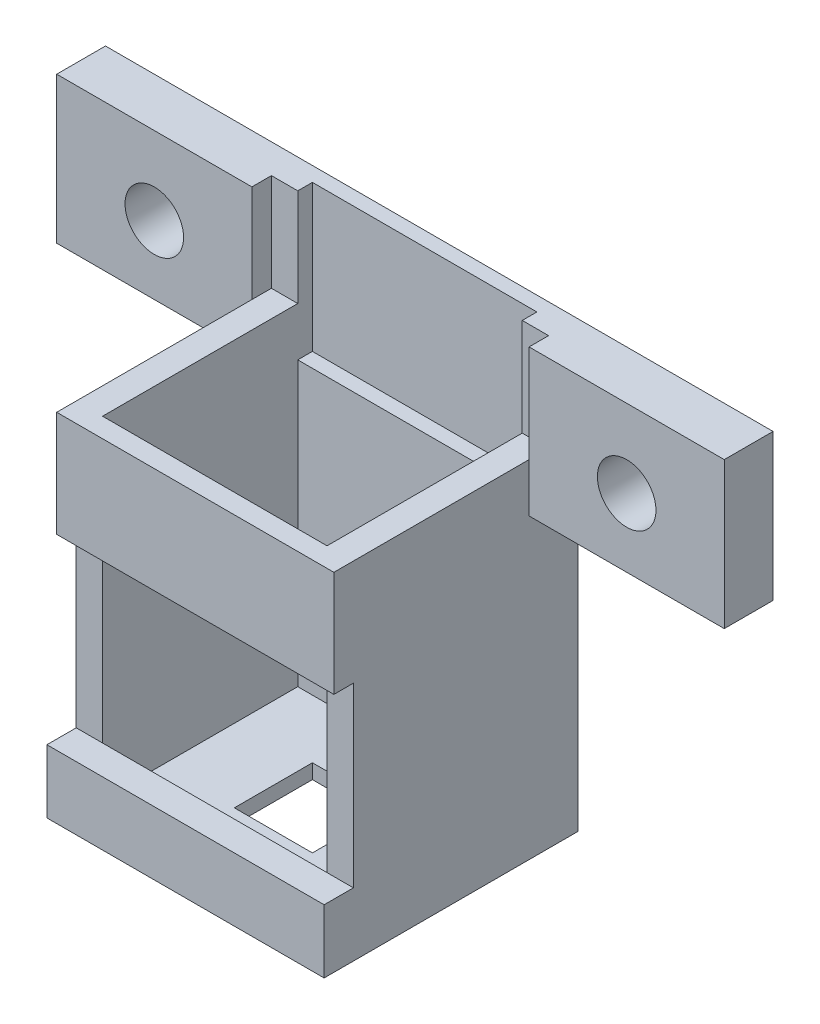
ISO-10303-21;
HEADER;
FILE_DESCRIPTION(('STEP AP214'),'2;1');
FILE_NAME('part.step','',(''),(''),'','','');
FILE_SCHEMA(('AUTOMOTIVE_DESIGN { 1 0 10303 214 1 1 1 1 }'));
ENDSEC;
DATA;
#1=APPLICATION_CONTEXT('core data for automotive mechanical design processes');
#2=APPLICATION_PROTOCOL_DEFINITION('international standard','automotive_design',2000,#1);
#3=PRODUCT_CONTEXT('',#1,'mechanical');
#4=PRODUCT('Part','Part','',(#3));
#5=PRODUCT_RELATED_PRODUCT_CATEGORY('part','',(#4));
#6=PRODUCT_DEFINITION_FORMATION('','',#4);
#7=PRODUCT_DEFINITION_CONTEXT('part definition',#1,'design');
#8=PRODUCT_DEFINITION('design','',#6,#7);
#9=PRODUCT_DEFINITION_SHAPE('','',#8);
#10=(LENGTH_UNIT() NAMED_UNIT(*) SI_UNIT(.MILLI.,.METRE.));
#11=(NAMED_UNIT(*) PLANE_ANGLE_UNIT() SI_UNIT($,.RADIAN.));
#12=(NAMED_UNIT(*) SI_UNIT($,.STERADIAN.) SOLID_ANGLE_UNIT());
#13=UNCERTAINTY_MEASURE_WITH_UNIT(LENGTH_MEASURE(1.E-05),#10,'distance_accuracy_value','');
#14=(GEOMETRIC_REPRESENTATION_CONTEXT(3) GLOBAL_UNCERTAINTY_ASSIGNED_CONTEXT((#13)) GLOBAL_UNIT_ASSIGNED_CONTEXT((#10,
#11,#12)) REPRESENTATION_CONTEXT('',''));
#15=CARTESIAN_POINT('',(0.,0.,0.));
#16=DIRECTION('',(0.,0.,1.));
#17=DIRECTION('',(1.,0.,0.));
#18=AXIS2_PLACEMENT_3D('',#15,#16,#17);
#19=CARTESIAN_POINT('',(0.,3.,0.));
#20=DIRECTION('',(0.,0.,-1.));
#21=DIRECTION('',(-1.,0.,0.));
#22=AXIS2_PLACEMENT_3D('',#19,#20,#21);
#23=PLANE('',#22);
#24=DIRECTION('',(1.,0.,0.));
#25=VECTOR('',#24,1.);
#26=CARTESIAN_POINT('',(25.7,26.1636598060892,0.));
#27=LINE('',#26,#25);
#28=CARTESIAN_POINT('',(23.,26.1636598060892,0.));
#29=VERTEX_POINT('',#28);
#30=CARTESIAN_POINT('',(25.7,26.1636598060892,0.));
#31=VERTEX_POINT('',#30);
#32=EDGE_CURVE('E276',#29,#31,#27,.T.);
#33=ORIENTED_EDGE('',*,*,#32,.F.);
#34=DIRECTION('',(0.,-1.,0.));
#35=VECTOR('',#34,1.);
#36=CARTESIAN_POINT('',(23.,0.,0.));
#37=LINE('',#36,#35);
#38=CARTESIAN_POINT('',(23.,8.,0.));
#39=VERTEX_POINT('',#38);
#40=EDGE_CURVE('E533',#29,#39,#37,.T.);
#41=ORIENTED_EDGE('',*,*,#40,.T.);
#42=DIRECTION('',(-1.,0.,0.));
#43=VECTOR('',#42,1.);
#44=CARTESIAN_POINT('',(-2.7,8.,0.));
#45=LINE('',#44,#43);
#46=CARTESIAN_POINT('',(25.7,8.,0.));
#47=VERTEX_POINT('',#46);
#48=EDGE_CURVE('E504',#47,#39,#45,.T.);
#49=ORIENTED_EDGE('',*,*,#48,.F.);
#50=DIRECTION('',(0.,-1.,0.));
#51=VECTOR('',#50,1.);
#52=CARTESIAN_POINT('',(25.7,0.,0.));
#53=LINE('',#52,#51);
#54=EDGE_CURVE('E54',#31,#47,#53,.T.);
#55=ORIENTED_EDGE('',*,*,#54,.F.);
#56=EDGE_LOOP('',(#33,#41,#49,#55));
#57=FACE_BOUND('',#56,.T.);
#58=ADVANCED_FACE('F39',(#57),#23,.F.);
#59=CARTESIAN_POINT('',(-2.7,26.1636598060892,0.));
#60=VERTEX_POINT('',#59);
#61=CARTESIAN_POINT('',(0.,26.1636598060892,0.));
#62=VERTEX_POINT('',#61);
#63=EDGE_CURVE('E62',#60,#62,#27,.T.);
#64=ORIENTED_EDGE('',*,*,#63,.F.);
#65=DIRECTION('',(0.,1.,0.));
#66=VECTOR('',#65,1.);
#67=CARTESIAN_POINT('',(-2.7,0.,0.));
#68=LINE('',#67,#66);
#69=CARTESIAN_POINT('',(-2.7,8.,0.));
#70=VERTEX_POINT('',#69);
#71=EDGE_CURVE('E544',#70,#60,#68,.T.);
#72=ORIENTED_EDGE('',*,*,#71,.F.);
#73=CARTESIAN_POINT('',(0.,8.,0.));
#74=VERTEX_POINT('',#73);
#75=EDGE_CURVE('E514',#74,#70,#45,.T.);
#76=ORIENTED_EDGE('',*,*,#75,.F.);
#77=DIRECTION('',(0.,1.,0.));
#78=VECTOR('',#77,1.);
#79=CARTESIAN_POINT('',(0.,0.,0.));
#80=LINE('',#79,#78);
#81=EDGE_CURVE('E543',#74,#62,#80,.T.);
#82=ORIENTED_EDGE('',*,*,#81,.T.);
#83=EDGE_LOOP('',(#64,#72,#76,#82));
#84=FACE_BOUND('',#83,.T.);
#85=ADVANCED_FACE('F636',(#84),#23,.F.);
#86=CARTESIAN_POINT('',(0.,0.,-20.));
#87=DIRECTION('',(0.,0.,-1.));
#88=DIRECTION('',(-1.,0.,0.));
#89=AXIS2_PLACEMENT_3D('',#86,#87,#88);
#90=PLANE('',#89);
#91=DIRECTION('',(1.,0.,0.));
#92=VECTOR('',#91,1.);
#93=CARTESIAN_POINT('',(-2.7,37.,-20.));
#94=LINE('',#93,#92);
#95=CARTESIAN_POINT('',(-2.7,37.,-20.));
#96=VERTEX_POINT('',#95);
#97=CARTESIAN_POINT('',(0.,37.,-20.));
#98=VERTEX_POINT('',#97);
#99=EDGE_CURVE('E551',#96,#98,#94,.T.);
#100=ORIENTED_EDGE('',*,*,#99,.T.);
#101=DIRECTION('',(0.,1.,0.));
#102=VECTOR('',#101,1.);
#103=CARTESIAN_POINT('',(0.,32.,-20.));
#104=LINE('',#103,#102);
#105=CARTESIAN_POINT('',(0.,47.,-20.));
#106=VERTEX_POINT('',#105);
#107=EDGE_CURVE('E313',#98,#106,#104,.T.);
#108=ORIENTED_EDGE('',*,*,#107,.T.);
#109=DIRECTION('',(1.,0.,0.));
#110=VECTOR('',#109,1.);
#111=CARTESIAN_POINT('',(25.7,47.,-20.));
#112=LINE('',#111,#110);
#113=CARTESIAN_POINT('',(-2.69999999999999,47.,-20.));
#114=VERTEX_POINT('',#113);
#115=EDGE_CURVE('E481',#114,#106,#112,.T.);
#116=ORIENTED_EDGE('',*,*,#115,.F.);
#117=DIRECTION('',(0.,1.,0.));
#118=VECTOR('',#117,1.);
#119=CARTESIAN_POINT('',(-2.69999999999999,47.,-20.));
#120=LINE('',#119,#118);
#121=EDGE_CURVE('E491',#96,#114,#120,.T.);
#122=ORIENTED_EDGE('',*,*,#121,.F.);
#123=EDGE_LOOP('',(#100,#108,#116,#122));
#124=FACE_BOUND('',#123,.T.);
#125=ADVANCED_FACE('F619',(#124),#90,.F.);
#126=CARTESIAN_POINT('',(23.,47.,-20.));
#127=VERTEX_POINT('',#126);
#128=CARTESIAN_POINT('',(25.7,47.,-20.));
#129=VERTEX_POINT('',#128);
#130=EDGE_CURVE('E495',#127,#129,#112,.T.);
#131=ORIENTED_EDGE('',*,*,#130,.F.);
#132=DIRECTION('',(0.,1.,0.));
#133=VECTOR('',#132,1.);
#134=CARTESIAN_POINT('',(23.,32.,-20.));
#135=LINE('',#134,#133);
#136=CARTESIAN_POINT('',(23.,37.,-20.));
#137=VERTEX_POINT('',#136);
#138=EDGE_CURVE('E330',#137,#127,#135,.T.);
#139=ORIENTED_EDGE('',*,*,#138,.F.);
#140=DIRECTION('',(-1.,0.,0.));
#141=VECTOR('',#140,1.);
#142=CARTESIAN_POINT('',(25.7,37.,-20.));
#143=LINE('',#142,#141);
#144=CARTESIAN_POINT('',(25.7,37.,-20.));
#145=VERTEX_POINT('',#144);
#146=EDGE_CURVE('E527',#145,#137,#143,.T.);
#147=ORIENTED_EDGE('',*,*,#146,.F.);
#148=DIRECTION('',(0.,-1.,0.));
#149=VECTOR('',#148,1.);
#150=CARTESIAN_POINT('',(25.7,47.,-20.));
#151=LINE('',#150,#149);
#152=EDGE_CURVE('E475',#129,#145,#151,.T.);
#153=ORIENTED_EDGE('',*,*,#152,.F.);
#154=EDGE_LOOP('',(#131,#139,#147,#153));
#155=FACE_BOUND('',#154,.T.);
#156=ADVANCED_FACE('F644',(#155),#90,.F.);
#157=CARTESIAN_POINT('',(25.7,0.,0.));
#158=DIRECTION('',(-1.,0.,0.));
#159=DIRECTION('',(0.,0.,1.));
#160=AXIS2_PLACEMENT_3D('',#157,#158,#159);
#161=PLANE('',#160);
#162=DIRECTION('',(0.,0.,1.));
#163=VECTOR('',#162,1.);
#164=CARTESIAN_POINT('',(25.7,1.5,0.));
#165=LINE('',#164,#163);
#166=CARTESIAN_POINT('',(25.7,1.5,-23.));
#167=VERTEX_POINT('',#166);
#168=CARTESIAN_POINT('',(25.7,1.5,3.));
#169=VERTEX_POINT('',#168);
#170=EDGE_CURVE('E353',#167,#169,#165,.T.);
#171=ORIENTED_EDGE('',*,*,#170,.F.);
#172=DIRECTION('',(0.,-1.,0.));
#173=VECTOR('',#172,1.);
#174=CARTESIAN_POINT('',(25.7,47.,-23.));
#175=LINE('',#174,#173);
#176=CARTESIAN_POINT('',(25.7,32.,-23.));
#177=VERTEX_POINT('',#176);
#178=EDGE_CURVE('E476',#177,#167,#175,.T.);
#179=ORIENTED_EDGE('',*,*,#178,.F.);
#180=DIRECTION('',(0.,0.,-1.));
#181=VECTOR('',#180,1.);
#182=CARTESIAN_POINT('',(25.7,32.,-23.));
#183=LINE('',#182,#181);
#184=CARTESIAN_POINT('',(25.7,32.,-18.));
#185=VERTEX_POINT('',#184);
#186=EDGE_CURVE('E445',#185,#177,#183,.T.);
#187=ORIENTED_EDGE('',*,*,#186,.F.);
#188=DIRECTION('',(0.,-1.,0.));
#189=VECTOR('',#188,1.);
#190=CARTESIAN_POINT('',(25.7,47.,-18.));
#191=LINE('',#190,#189);
#192=CARTESIAN_POINT('',(25.7,37.,-18.));
#193=VERTEX_POINT('',#192);
#194=EDGE_CURVE('E47',#193,#185,#191,.T.);
#195=ORIENTED_EDGE('',*,*,#194,.F.);
#196=DIRECTION('',(0.,0.,1.));
#197=VECTOR('',#196,1.);
#198=CARTESIAN_POINT('',(25.7,37.,0.));
#199=LINE('',#198,#197);
#200=CARTESIAN_POINT('',(25.7,37.,2.));
#201=VERTEX_POINT('',#200);
#202=EDGE_CURVE('E242',#193,#201,#199,.T.);
#203=ORIENTED_EDGE('',*,*,#202,.T.);
#204=DIRECTION('',(0.,1.,0.));
#205=VECTOR('',#204,1.);
#206=CARTESIAN_POINT('',(25.7,37.,2.));
#207=LINE('',#206,#205);
#208=CARTESIAN_POINT('',(25.7,26.1636598060892,2.));
#209=VERTEX_POINT('',#208);
#210=EDGE_CURVE('E248',#209,#201,#207,.T.);
#211=ORIENTED_EDGE('',*,*,#210,.F.);
#212=DIRECTION('',(0.,0.,-1.));
#213=VECTOR('',#212,1.);
#214=CARTESIAN_POINT('',(25.7,26.1636598060892,2.));
#215=LINE('',#214,#213);
#216=EDGE_CURVE('E282',#209,#31,#215,.T.);
#217=ORIENTED_EDGE('',*,*,#216,.T.);
#218=ORIENTED_EDGE('',*,*,#54,.T.);
#219=DIRECTION('',(0.,0.,-1.));
#220=VECTOR('',#219,1.);
#221=CARTESIAN_POINT('',(25.7,8.,3.));
#222=LINE('',#221,#220);
#223=CARTESIAN_POINT('',(25.7,8.,3.));
#224=VERTEX_POINT('',#223);
#225=EDGE_CURVE('E518',#224,#47,#222,.T.);
#226=ORIENTED_EDGE('',*,*,#225,.F.);
#227=DIRECTION('',(0.,1.,0.));
#228=VECTOR('',#227,1.);
#229=CARTESIAN_POINT('',(25.7,0.,3.));
#230=LINE('',#229,#228);
#231=EDGE_CURVE('E503',#169,#224,#230,.T.);
#232=ORIENTED_EDGE('',*,*,#231,.F.);
#233=EDGE_LOOP('',(#171,#179,#187,#195,#203,#211,#217,#218,#226,#232));
#234=FACE_BOUND('',#233,.T.);
#235=ADVANCED_FACE('F245',(#234),#161,.F.);
#236=CARTESIAN_POINT('',(-2.7,0.,0.));
#237=DIRECTION('',(-1.,0.,0.));
#238=DIRECTION('',(0.,0.,1.));
#239=AXIS2_PLACEMENT_3D('',#236,#237,#238);
#240=PLANE('',#239);
#241=DIRECTION('',(0.,1.,0.));
#242=VECTOR('',#241,1.);
#243=CARTESIAN_POINT('',(-2.69999999999999,47.,-23.));
#244=LINE('',#243,#242);
#245=CARTESIAN_POINT('',(-2.7,1.5,-23.));
#246=VERTEX_POINT('',#245);
#247=CARTESIAN_POINT('',(-2.7,32.,-23.));
#248=VERTEX_POINT('',#247);
#249=EDGE_CURVE('E480',#246,#248,#244,.T.);
#250=ORIENTED_EDGE('',*,*,#249,.F.);
#251=DIRECTION('',(0.,0.,-1.));
#252=VECTOR('',#251,1.);
#253=CARTESIAN_POINT('',(-2.7,1.5,3.));
#254=LINE('',#253,#252);
#255=CARTESIAN_POINT('',(-2.7,1.5,3.));
#256=VERTEX_POINT('',#255);
#257=EDGE_CURVE('E326',#256,#246,#254,.T.);
#258=ORIENTED_EDGE('',*,*,#257,.F.);
#259=DIRECTION('',(0.,-1.,0.));
#260=VECTOR('',#259,1.);
#261=CARTESIAN_POINT('',(-2.7,0.,3.));
#262=LINE('',#261,#260);
#263=CARTESIAN_POINT('',(-2.7,8.,3.));
#264=VERTEX_POINT('',#263);
#265=EDGE_CURVE('E499',#264,#256,#262,.T.);
#266=ORIENTED_EDGE('',*,*,#265,.F.);
#267=DIRECTION('',(0.,0.,-1.));
#268=VECTOR('',#267,1.);
#269=CARTESIAN_POINT('',(-2.7,8.,3.));
#270=LINE('',#269,#268);
#271=EDGE_CURVE('E510',#264,#70,#270,.T.);
#272=ORIENTED_EDGE('',*,*,#271,.T.);
#273=ORIENTED_EDGE('',*,*,#71,.T.);
#274=DIRECTION('',(0.,0.,-1.));
#275=VECTOR('',#274,1.);
#276=CARTESIAN_POINT('',(-2.7,26.1636598060892,2.));
#277=LINE('',#276,#275);
#278=CARTESIAN_POINT('',(-2.7,26.1636598060892,2.));
#279=VERTEX_POINT('',#278);
#280=EDGE_CURVE('E289',#279,#60,#277,.T.);
#281=ORIENTED_EDGE('',*,*,#280,.F.);
#282=DIRECTION('',(0.,-1.,0.));
#283=VECTOR('',#282,1.);
#284=CARTESIAN_POINT('',(-2.7,37.,2.));
#285=LINE('',#284,#283);
#286=CARTESIAN_POINT('',(-2.7,37.,2.));
#287=VERTEX_POINT('',#286);
#288=EDGE_CURVE('E265',#287,#279,#285,.T.);
#289=ORIENTED_EDGE('',*,*,#288,.F.);
#290=DIRECTION('',(0.,0.,-1.));
#291=VECTOR('',#290,1.);
#292=CARTESIAN_POINT('',(-2.7,37.,0.));
#293=LINE('',#292,#291);
#294=CARTESIAN_POINT('',(-2.7,37.,-18.));
#295=VERTEX_POINT('',#294);
#296=EDGE_CURVE('E261',#287,#295,#293,.T.);
#297=ORIENTED_EDGE('',*,*,#296,.T.);
#298=DIRECTION('',(0.,1.,0.));
#299=VECTOR('',#298,1.);
#300=CARTESIAN_POINT('',(-2.7,47.,-18.));
#301=LINE('',#300,#299);
#302=CARTESIAN_POINT('',(-2.7,32.,-18.));
#303=VERTEX_POINT('',#302);
#304=EDGE_CURVE('E421',#303,#295,#301,.T.);
#305=ORIENTED_EDGE('',*,*,#304,.F.);
#306=DIRECTION('',(0.,0.,1.));
#307=VECTOR('',#306,1.);
#308=CARTESIAN_POINT('',(-2.7,32.,-23.));
#309=LINE('',#308,#307);
#310=EDGE_CURVE('E392',#248,#303,#309,.T.);
#311=ORIENTED_EDGE('',*,*,#310,.F.);
#312=EDGE_LOOP('',(#250,#258,#266,#272,#273,#281,#289,#297,#305,#311));
#313=FACE_BOUND('',#312,.T.);
#314=ADVANCED_FACE('F634',(#313),#240,.T.);
#315=CARTESIAN_POINT('',(0.,0.,3.));
#316=DIRECTION('',(0.,0.,-1.));
#317=DIRECTION('',(-1.,0.,0.));
#318=AXIS2_PLACEMENT_3D('',#315,#316,#317);
#319=PLANE('',#318);
#320=DIRECTION('',(-1.,0.,0.));
#321=VECTOR('',#320,1.);
#322=CARTESIAN_POINT('',(-2.7,1.5,3.));
#323=LINE('',#322,#321);
#324=EDGE_CURVE('E341',#169,#256,#323,.T.);
#325=ORIENTED_EDGE('',*,*,#324,.F.);
#326=ORIENTED_EDGE('',*,*,#231,.T.);
#327=DIRECTION('',(-1.,0.,0.));
#328=VECTOR('',#327,1.);
#329=CARTESIAN_POINT('',(-2.7,8.,3.));
#330=LINE('',#329,#328);
#331=EDGE_CURVE('E507',#224,#264,#330,.T.);
#332=ORIENTED_EDGE('',*,*,#331,.T.);
#333=ORIENTED_EDGE('',*,*,#265,.T.);
#334=EDGE_LOOP('',(#325,#326,#332,#333));
#335=FACE_BOUND('',#334,.T.);
#336=ADVANCED_FACE('F674',(#335),#319,.F.);
#337=CARTESIAN_POINT('',(0.,0.,-23.));
#338=DIRECTION('',(0.,0.,-1.));
#339=DIRECTION('',(-1.,0.,0.));
#340=AXIS2_PLACEMENT_3D('',#337,#338,#339);
#341=PLANE('',#340);
#342=CARTESIAN_POINT('',(-12.7,39.,-23.));
#343=DIRECTION('',(0.,0.,-1.));
#344=DIRECTION('',(-1.,0.,0.));
#345=AXIS2_PLACEMENT_3D('',#342,#343,#344);
#346=CIRCLE('',#345,3.);
#347=CARTESIAN_POINT('',(-15.7,39.,-23.));
#348=VERTEX_POINT('',#347);
#349=EDGE_CURVE('E361',#348,#348,#346,.T.);
#350=ORIENTED_EDGE('',*,*,#349,.F.);
#351=EDGE_LOOP('',(#350));
#352=FACE_BOUND('',#351,.T.);
#353=CARTESIAN_POINT('',(35.7,39.,-23.));
#354=DIRECTION('',(0.,0.,-1.));
#355=DIRECTION('',(-1.,0.,0.));
#356=AXIS2_PLACEMENT_3D('',#353,#354,#355);
#357=CIRCLE('',#356,3.);
#358=CARTESIAN_POINT('',(32.7,39.,-23.));
#359=VERTEX_POINT('',#358);
#360=EDGE_CURVE('E368',#359,#359,#357,.T.);
#361=ORIENTED_EDGE('',*,*,#360,.F.);
#362=EDGE_LOOP('',(#361));
#363=FACE_BOUND('',#362,.T.);
#364=ORIENTED_EDGE('',*,*,#178,.T.);
#365=DIRECTION('',(1.,0.,0.));
#366=VECTOR('',#365,1.);
#367=CARTESIAN_POINT('',(-2.7,1.5,-23.));
#368=LINE('',#367,#366);
#369=EDGE_CURVE('E338',#246,#167,#368,.T.);
#370=ORIENTED_EDGE('',*,*,#369,.F.);
#371=ORIENTED_EDGE('',*,*,#249,.T.);
#372=DIRECTION('',(1.,0.,0.));
#373=VECTOR('',#372,1.);
#374=CARTESIAN_POINT('',(-22.7,32.,-23.));
#375=LINE('',#374,#373);
#376=CARTESIAN_POINT('',(-22.7,32.,-23.));
#377=VERTEX_POINT('',#376);
#378=EDGE_CURVE('E435',#377,#248,#375,.T.);
#379=ORIENTED_EDGE('',*,*,#378,.F.);
#380=DIRECTION('',(0.,-1.,0.));
#381=VECTOR('',#380,1.);
#382=CARTESIAN_POINT('',(-22.7,47.,-23.));
#383=LINE('',#382,#381);
#384=CARTESIAN_POINT('',(-22.7,47.,-23.));
#385=VERTEX_POINT('',#384);
#386=EDGE_CURVE('E401',#385,#377,#383,.T.);
#387=ORIENTED_EDGE('',*,*,#386,.F.);
#388=DIRECTION('',(1.,0.,0.));
#389=VECTOR('',#388,1.);
#390=CARTESIAN_POINT('',(25.7,47.,-23.));
#391=LINE('',#390,#389);
#392=CARTESIAN_POINT('',(45.7,47.,-23.));
#393=VERTEX_POINT('',#392);
#394=EDGE_CURVE('E484',#385,#393,#391,.T.);
#395=ORIENTED_EDGE('',*,*,#394,.T.);
#396=DIRECTION('',(0.,1.,0.));
#397=VECTOR('',#396,1.);
#398=CARTESIAN_POINT('',(45.7,47.,-23.));
#399=LINE('',#398,#397);
#400=CARTESIAN_POINT('',(45.7,32.,-23.));
#401=VERTEX_POINT('',#400);
#402=EDGE_CURVE('E440',#401,#393,#399,.T.);
#403=ORIENTED_EDGE('',*,*,#402,.F.);
#404=DIRECTION('',(-1.,0.,0.));
#405=VECTOR('',#404,1.);
#406=CARTESIAN_POINT('',(45.7,32.,-23.));
#407=LINE('',#406,#405);
#408=EDGE_CURVE('E454',#401,#177,#407,.T.);
#409=ORIENTED_EDGE('',*,*,#408,.T.);
#410=EDGE_LOOP('',(#364,#370,#371,#379,#387,#395,#403,#409));
#411=FACE_BOUND('',#410,.T.);
#412=ADVANCED_FACE('F668',(#352,#363,#411),#341,.T.);
#413=CARTESIAN_POINT('',(7.5,-12.,-6.));
#414=DIRECTION('',(-1.,0.,0.));
#415=DIRECTION('',(0.,0.,1.));
#416=AXIS2_PLACEMENT_3D('',#413,#414,#415);
#417=PLANE('',#416);
#418=DIRECTION('',(0.,0.,1.));
#419=VECTOR('',#418,1.);
#420=CARTESIAN_POINT('',(7.5,1.5,-6.));
#421=LINE('',#420,#419);
#422=CARTESIAN_POINT('',(7.5,1.5,-14.));
#423=VERTEX_POINT('',#422);
#424=CARTESIAN_POINT('',(7.5,1.5,-6.));
#425=VERTEX_POINT('',#424);
#426=EDGE_CURVE('E350',#423,#425,#421,.T.);
#427=ORIENTED_EDGE('',*,*,#426,.F.);
#428=DIRECTION('',(0.,1.,0.));
#429=VECTOR('',#428,1.);
#430=CARTESIAN_POINT('',(7.5,-12.,-14.));
#431=LINE('',#430,#429);
#432=CARTESIAN_POINT('',(7.5,3.,-14.));
#433=VERTEX_POINT('',#432);
#434=EDGE_CURVE('E389',#423,#433,#431,.T.);
#435=ORIENTED_EDGE('',*,*,#434,.T.);
#436=DIRECTION('',(0.,0.,1.));
#437=VECTOR('',#436,1.);
#438=CARTESIAN_POINT('',(7.5,3.,-6.));
#439=LINE('',#438,#437);
#440=CARTESIAN_POINT('',(7.5,3.,-6.));
#441=VERTEX_POINT('',#440);
#442=EDGE_CURVE('E372',#433,#441,#439,.T.);
#443=ORIENTED_EDGE('',*,*,#442,.T.);
#444=DIRECTION('',(0.,1.,0.));
#445=VECTOR('',#444,1.);
#446=CARTESIAN_POINT('',(7.5,-12.,-6.));
#447=LINE('',#446,#445);
#448=EDGE_CURVE('E388',#425,#441,#447,.T.);
#449=ORIENTED_EDGE('',*,*,#448,.F.);
#450=EDGE_LOOP('',(#427,#435,#443,#449));
#451=FACE_BOUND('',#450,.T.);
#452=ADVANCED_FACE('F756',(#451),#417,.F.);
#453=CARTESIAN_POINT('',(7.5,-12.,-14.));
#454=DIRECTION('',(0.,0.,-1.));
#455=DIRECTION('',(-1.,0.,0.));
#456=AXIS2_PLACEMENT_3D('',#453,#454,#455);
#457=PLANE('',#456);
#458=DIRECTION('',(-1.,0.,0.));
#459=VECTOR('',#458,1.);
#460=CARTESIAN_POINT('',(7.5,1.5,-14.));
#461=LINE('',#460,#459);
#462=CARTESIAN_POINT('',(15.5,1.5,-14.));
#463=VERTEX_POINT('',#462);
#464=EDGE_CURVE('E347',#463,#423,#461,.T.);
#465=ORIENTED_EDGE('',*,*,#464,.F.);
#466=DIRECTION('',(0.,1.,0.));
#467=VECTOR('',#466,1.);
#468=CARTESIAN_POINT('',(15.5,-12.,-14.));
#469=LINE('',#468,#467);
#470=CARTESIAN_POINT('',(15.5,3.,-14.));
#471=VERTEX_POINT('',#470);
#472=EDGE_CURVE('E393',#463,#471,#469,.T.);
#473=ORIENTED_EDGE('',*,*,#472,.T.);
#474=DIRECTION('',(-1.,0.,0.));
#475=VECTOR('',#474,1.);
#476=CARTESIAN_POINT('',(7.5,3.,-14.));
#477=LINE('',#476,#475);
#478=EDGE_CURVE('E384',#471,#433,#477,.T.);
#479=ORIENTED_EDGE('',*,*,#478,.T.);
#480=ORIENTED_EDGE('',*,*,#434,.F.);
#481=EDGE_LOOP('',(#465,#473,#479,#480));
#482=FACE_BOUND('',#481,.T.);
#483=ADVANCED_FACE('F750',(#482),#457,.F.);
#484=CARTESIAN_POINT('',(15.5,-12.,-6.));
#485=DIRECTION('',(1.,0.,0.));
#486=DIRECTION('',(0.,0.,-1.));
#487=AXIS2_PLACEMENT_3D('',#484,#485,#486);
#488=PLANE('',#487);
#489=DIRECTION('',(0.,0.,-1.));
#490=VECTOR('',#489,1.);
#491=CARTESIAN_POINT('',(15.5,1.5,-6.));
#492=LINE('',#491,#490);
#493=CARTESIAN_POINT('',(15.5,1.5,-6.));
#494=VERTEX_POINT('',#493);
#495=EDGE_CURVE('E344',#494,#463,#492,.T.);
#496=ORIENTED_EDGE('',*,*,#495,.F.);
#497=DIRECTION('',(0.,1.,0.));
#498=VECTOR('',#497,1.);
#499=CARTESIAN_POINT('',(15.5,-12.,-6.));
#500=LINE('',#499,#498);
#501=CARTESIAN_POINT('',(15.5,3.,-6.));
#502=VERTEX_POINT('',#501);
#503=EDGE_CURVE('E396',#494,#502,#500,.T.);
#504=ORIENTED_EDGE('',*,*,#503,.T.);
#505=DIRECTION('',(0.,0.,-1.));
#506=VECTOR('',#505,1.);
#507=CARTESIAN_POINT('',(15.5,3.,-6.));
#508=LINE('',#507,#506);
#509=EDGE_CURVE('E380',#502,#471,#508,.T.);
#510=ORIENTED_EDGE('',*,*,#509,.T.);
#511=ORIENTED_EDGE('',*,*,#472,.F.);
#512=EDGE_LOOP('',(#496,#504,#510,#511));
#513=FACE_BOUND('',#512,.T.);
#514=ADVANCED_FACE('F744',(#513),#488,.F.);
#515=CARTESIAN_POINT('',(7.5,-12.,-6.));
#516=DIRECTION('',(0.,0.,1.));
#517=DIRECTION('',(1.,0.,0.));
#518=AXIS2_PLACEMENT_3D('',#515,#516,#517);
#519=PLANE('',#518);
#520=DIRECTION('',(1.,0.,0.));
#521=VECTOR('',#520,1.);
#522=CARTESIAN_POINT('',(7.5,1.5,-6.));
#523=LINE('',#522,#521);
#524=EDGE_CURVE('E11',#425,#494,#523,.T.);
#525=ORIENTED_EDGE('',*,*,#524,.F.);
#526=ORIENTED_EDGE('',*,*,#448,.T.);
#527=DIRECTION('',(1.,0.,0.));
#528=VECTOR('',#527,1.);
#529=CARTESIAN_POINT('',(7.5,3.,-6.));
#530=LINE('',#529,#528);
#531=EDGE_CURVE('E376',#441,#502,#530,.T.);
#532=ORIENTED_EDGE('',*,*,#531,.T.);
#533=ORIENTED_EDGE('',*,*,#503,.F.);
#534=EDGE_LOOP('',(#525,#526,#532,#533));
#535=FACE_BOUND('',#534,.T.);
#536=ADVANCED_FACE('F739',(#535),#519,.F.);
#537=CARTESIAN_POINT('',(0.,3.,0.));
#538=DIRECTION('',(0.,-1.,0.));
#539=DIRECTION('',(0.,0.,-1.));
#540=AXIS2_PLACEMENT_3D('',#537,#538,#539);
#541=PLANE('',#540);
#542=DIRECTION('',(0.,0.,1.));
#543=VECTOR('',#542,1.);
#544=CARTESIAN_POINT('',(0.,3.,0.));
#545=LINE('',#544,#543);
#546=CARTESIAN_POINT('',(0.,3.,-20.));
#547=VERTEX_POINT('',#546);
#548=CARTESIAN_POINT('',(0.,3.,0.));
#549=VERTEX_POINT('',#548);
#550=EDGE_CURVE('E564',#547,#549,#545,.T.);
#551=ORIENTED_EDGE('',*,*,#550,.T.);
#552=DIRECTION('',(1.,0.,0.));
#553=VECTOR('',#552,1.);
#554=CARTESIAN_POINT('',(0.,3.,0.));
#555=LINE('',#554,#553);
#556=CARTESIAN_POINT('',(23.,3.,0.));
#557=VERTEX_POINT('',#556);
#558=EDGE_CURVE('E568',#549,#557,#555,.T.);
#559=ORIENTED_EDGE('',*,*,#558,.T.);
#560=DIRECTION('',(0.,0.,-1.));
#561=VECTOR('',#560,1.);
#562=CARTESIAN_POINT('',(23.,3.,0.));
#563=LINE('',#562,#561);
#564=CARTESIAN_POINT('',(23.,3.,-20.));
#565=VERTEX_POINT('',#564);
#566=EDGE_CURVE('E572',#557,#565,#563,.T.);
#567=ORIENTED_EDGE('',*,*,#566,.T.);
#568=DIRECTION('',(-1.,0.,0.));
#569=VECTOR('',#568,1.);
#570=CARTESIAN_POINT('',(0.,3.,-20.));
#571=LINE('',#570,#569);
#572=EDGE_CURVE('E575',#565,#547,#571,.T.);
#573=ORIENTED_EDGE('',*,*,#572,.T.);
#574=EDGE_LOOP('',(#551,#559,#567,#573));
#575=FACE_BOUND('',#574,.T.);
#576=ORIENTED_EDGE('',*,*,#442,.F.);
#577=ORIENTED_EDGE('',*,*,#478,.F.);
#578=ORIENTED_EDGE('',*,*,#509,.F.);
#579=ORIENTED_EDGE('',*,*,#531,.F.);
#580=EDGE_LOOP('',(#576,#577,#578,#579));
#581=FACE_BOUND('',#580,.T.);
#582=ADVANCED_FACE('F598',(#575,#581),#541,.F.);
#583=CARTESIAN_POINT('',(-2.7,37.,0.));
#584=DIRECTION('',(0.,-1.,0.));
#585=DIRECTION('',(0.,0.,-1.));
#586=AXIS2_PLACEMENT_3D('',#583,#584,#585);
#587=PLANE('',#586);
#588=DIRECTION('',(0.,0.,-1.));
#589=VECTOR('',#588,1.);
#590=CARTESIAN_POINT('',(0.,37.,0.));
#591=LINE('',#590,#589);
#592=CARTESIAN_POINT('',(0.,37.,0.));
#593=VERTEX_POINT('',#592);
#594=EDGE_CURVE('E556',#593,#98,#591,.T.);
#595=ORIENTED_EDGE('',*,*,#594,.T.);
#596=ORIENTED_EDGE('',*,*,#99,.F.);
#597=EDGE_CURVE('E547',#295,#96,#293,.T.);
#598=ORIENTED_EDGE('',*,*,#597,.F.);
#599=ORIENTED_EDGE('',*,*,#296,.F.);
#600=DIRECTION('',(-1.,0.,0.));
#601=VECTOR('',#600,1.);
#602=CARTESIAN_POINT('',(25.7,37.,2.));
#603=LINE('',#602,#601);
#604=EDGE_CURVE('E257',#201,#287,#603,.T.);
#605=ORIENTED_EDGE('',*,*,#604,.F.);
#606=ORIENTED_EDGE('',*,*,#202,.F.);
#607=EDGE_CURVE('E254',#145,#193,#199,.T.);
#608=ORIENTED_EDGE('',*,*,#607,.F.);
#609=ORIENTED_EDGE('',*,*,#146,.T.);
#610=DIRECTION('',(0.,0.,1.));
#611=VECTOR('',#610,1.);
#612=CARTESIAN_POINT('',(23.,37.,0.));
#613=LINE('',#612,#611);
#614=CARTESIAN_POINT('',(23.,37.,0.));
#615=VERTEX_POINT('',#614);
#616=EDGE_CURVE('E524',#137,#615,#613,.T.);
#617=ORIENTED_EDGE('',*,*,#616,.T.);
#618=DIRECTION('',(-1.,0.,0.));
#619=VECTOR('',#618,1.);
#620=CARTESIAN_POINT('',(25.7,37.,0.));
#621=LINE('',#620,#619);
#622=EDGE_CURVE('E283',#615,#593,#621,.T.);
#623=ORIENTED_EDGE('',*,*,#622,.T.);
#624=EDGE_LOOP('',(#595,#596,#598,#599,#605,#606,#608,#609,#617,#623));
#625=FACE_BOUND('',#624,.T.);
#626=ADVANCED_FACE('F259',(#625),#587,.F.);
#627=CARTESIAN_POINT('',(0.,0.,0.));
#628=DIRECTION('',(-1.,0.,0.));
#629=DIRECTION('',(0.,0.,1.));
#630=AXIS2_PLACEMENT_3D('',#627,#628,#629);
#631=PLANE('',#630);
#632=ORIENTED_EDGE('',*,*,#550,.F.);
#633=DIRECTION('',(0.,-1.,0.));
#634=VECTOR('',#633,1.);
#635=CARTESIAN_POINT('',(0.,0.,-20.));
#636=LINE('',#635,#634);
#637=CARTESIAN_POINT('',(0.,32.,-20.));
#638=VERTEX_POINT('',#637);
#639=EDGE_CURVE('E548',#638,#547,#636,.T.);
#640=ORIENTED_EDGE('',*,*,#639,.F.);
#641=DIRECTION('',(0.,0.,1.));
#642=VECTOR('',#641,1.);
#643=CARTESIAN_POINT('',(0.,32.,-20.));
#644=LINE('',#643,#642);
#645=CARTESIAN_POINT('',(0.,32.,-21.5));
#646=VERTEX_POINT('',#645);
#647=EDGE_CURVE('E297',#646,#638,#644,.T.);
#648=ORIENTED_EDGE('',*,*,#647,.F.);
#649=DIRECTION('',(0.,1.,0.));
#650=VECTOR('',#649,1.);
#651=CARTESIAN_POINT('',(0.,32.,-21.5));
#652=LINE('',#651,#650);
#653=CARTESIAN_POINT('',(0.,47.,-21.5));
#654=VERTEX_POINT('',#653);
#655=EDGE_CURVE('E323',#646,#654,#652,.T.);
#656=ORIENTED_EDGE('',*,*,#655,.T.);
#657=DIRECTION('',(0.,0.,1.));
#658=VECTOR('',#657,1.);
#659=CARTESIAN_POINT('',(0.,47.,-20.));
#660=LINE('',#659,#658);
#661=EDGE_CURVE('E296',#654,#106,#660,.T.);
#662=ORIENTED_EDGE('',*,*,#661,.T.);
#663=ORIENTED_EDGE('',*,*,#107,.F.);
#664=ORIENTED_EDGE('',*,*,#594,.F.);
#665=DIRECTION('',(0.,-1.,0.));
#666=VECTOR('',#665,1.);
#667=CARTESIAN_POINT('',(0.,0.,0.));
#668=LINE('',#667,#666);
#669=EDGE_CURVE('E293',#593,#62,#668,.T.);
#670=ORIENTED_EDGE('',*,*,#669,.T.);
#671=ORIENTED_EDGE('',*,*,#81,.F.);
#672=EDGE_CURVE('E552',#549,#74,#80,.T.);
#673=ORIENTED_EDGE('',*,*,#672,.F.);
#674=EDGE_LOOP('',(#632,#640,#648,#656,#662,#663,#664,#670,#671,#673));
#675=FACE_BOUND('',#674,.T.);
#676=ADVANCED_FACE('F596',(#675),#631,.F.);
#677=CARTESIAN_POINT('',(23.,0.,0.));
#678=DIRECTION('',(-1.,0.,0.));
#679=DIRECTION('',(0.,0.,1.));
#680=AXIS2_PLACEMENT_3D('',#677,#678,#679);
#681=PLANE('',#680);
#682=ORIENTED_EDGE('',*,*,#566,.F.);
#683=EDGE_CURVE('E522',#39,#557,#37,.T.);
#684=ORIENTED_EDGE('',*,*,#683,.F.);
#685=ORIENTED_EDGE('',*,*,#40,.F.);
#686=EDGE_CURVE('E528',#615,#29,#37,.T.);
#687=ORIENTED_EDGE('',*,*,#686,.F.);
#688=ORIENTED_EDGE('',*,*,#616,.F.);
#689=ORIENTED_EDGE('',*,*,#138,.T.);
#690=DIRECTION('',(0.,0.,-1.));
#691=VECTOR('',#690,1.);
#692=CARTESIAN_POINT('',(23.,47.,-20.));
#693=LINE('',#692,#691);
#694=CARTESIAN_POINT('',(23.,47.,-21.5));
#695=VERTEX_POINT('',#694);
#696=EDGE_CURVE('E316',#127,#695,#693,.T.);
#697=ORIENTED_EDGE('',*,*,#696,.T.);
#698=DIRECTION('',(0.,1.,0.));
#699=VECTOR('',#698,1.);
#700=CARTESIAN_POINT('',(23.,32.,-21.5));
#701=LINE('',#700,#699);
#702=CARTESIAN_POINT('',(23.,32.,-21.5));
#703=VERTEX_POINT('',#702);
#704=EDGE_CURVE('E327',#703,#695,#701,.T.);
#705=ORIENTED_EDGE('',*,*,#704,.F.);
#706=DIRECTION('',(0.,0.,-1.));
#707=VECTOR('',#706,1.);
#708=CARTESIAN_POINT('',(23.,32.,-20.));
#709=LINE('',#708,#707);
#710=CARTESIAN_POINT('',(23.,32.,-20.));
#711=VERTEX_POINT('',#710);
#712=EDGE_CURVE('E305',#711,#703,#709,.T.);
#713=ORIENTED_EDGE('',*,*,#712,.F.);
#714=DIRECTION('',(0.,1.,0.));
#715=VECTOR('',#714,1.);
#716=CARTESIAN_POINT('',(23.,0.,-20.));
#717=LINE('',#716,#715);
#718=EDGE_CURVE('E532',#565,#711,#717,.T.);
#719=ORIENTED_EDGE('',*,*,#718,.F.);
#720=EDGE_LOOP('',(#682,#684,#685,#687,#688,#689,#697,#705,#713,#719));
#721=FACE_BOUND('',#720,.T.);
#722=ADVANCED_FACE('F602',(#721),#681,.T.);
#723=CARTESIAN_POINT('',(-2.7,8.,3.));
#724=DIRECTION('',(0.,-1.,0.));
#725=DIRECTION('',(0.,0.,-1.));
#726=AXIS2_PLACEMENT_3D('',#723,#724,#725);
#727=PLANE('',#726);
#728=ORIENTED_EDGE('',*,*,#48,.T.);
#729=EDGE_CURVE('E487',#39,#74,#45,.T.);
#730=ORIENTED_EDGE('',*,*,#729,.T.);
#731=ORIENTED_EDGE('',*,*,#75,.T.);
#732=ORIENTED_EDGE('',*,*,#271,.F.);
#733=ORIENTED_EDGE('',*,*,#331,.F.);
#734=ORIENTED_EDGE('',*,*,#225,.T.);
#735=EDGE_LOOP('',(#728,#730,#731,#732,#733,#734));
#736=FACE_BOUND('',#735,.T.);
#737=ADVANCED_FACE('F587',(#736),#727,.F.);
#738=CARTESIAN_POINT('',(0.,0.,0.));
#739=DIRECTION('',(0.,0.,-1.));
#740=DIRECTION('',(-1.,0.,0.));
#741=AXIS2_PLACEMENT_3D('',#738,#739,#740);
#742=PLANE('',#741);
#743=ORIENTED_EDGE('',*,*,#729,.F.);
#744=ORIENTED_EDGE('',*,*,#683,.T.);
#745=ORIENTED_EDGE('',*,*,#558,.F.);
#746=ORIENTED_EDGE('',*,*,#672,.T.);
#747=EDGE_LOOP('',(#743,#744,#745,#746));
#748=FACE_BOUND('',#747,.T.);
#749=ADVANCED_FACE('F590',(#748),#742,.T.);
#750=ORIENTED_EDGE('',*,*,#718,.T.);
#751=DIRECTION('',(1.,0.,0.));
#752=VECTOR('',#751,1.);
#753=CARTESIAN_POINT('',(0.,32.,-20.));
#754=LINE('',#753,#752);
#755=EDGE_CURVE('E300',#638,#711,#754,.T.);
#756=ORIENTED_EDGE('',*,*,#755,.F.);
#757=ORIENTED_EDGE('',*,*,#639,.T.);
#758=ORIENTED_EDGE('',*,*,#572,.F.);
#759=EDGE_LOOP('',(#750,#756,#757,#758));
#760=FACE_BOUND('',#759,.T.);
#761=ADVANCED_FACE('F606',(#760),#90,.F.);
#762=CARTESIAN_POINT('',(25.7,47.,-23.));
#763=DIRECTION('',(0.,-1.,0.));
#764=DIRECTION('',(0.,0.,-1.));
#765=AXIS2_PLACEMENT_3D('',#762,#763,#764);
#766=PLANE('',#765);
#767=ORIENTED_EDGE('',*,*,#115,.T.);
#768=ORIENTED_EDGE('',*,*,#661,.F.);
#769=DIRECTION('',(-1.,0.,0.));
#770=VECTOR('',#769,1.);
#771=CARTESIAN_POINT('',(0.,47.,-21.5));
#772=LINE('',#771,#770);
#773=EDGE_CURVE('E301',#695,#654,#772,.T.);
#774=ORIENTED_EDGE('',*,*,#773,.F.);
#775=ORIENTED_EDGE('',*,*,#696,.F.);
#776=ORIENTED_EDGE('',*,*,#130,.T.);
#777=DIRECTION('',(0.,0.,1.));
#778=VECTOR('',#777,1.);
#779=CARTESIAN_POINT('',(25.7,47.,-23.));
#780=LINE('',#779,#778);
#781=CARTESIAN_POINT('',(25.7,47.,-18.));
#782=VERTEX_POINT('',#781);
#783=EDGE_CURVE('E439',#129,#782,#780,.T.);
#784=ORIENTED_EDGE('',*,*,#783,.T.);
#785=DIRECTION('',(-1.,0.,0.));
#786=VECTOR('',#785,1.);
#787=CARTESIAN_POINT('',(45.7,47.,-18.));
#788=LINE('',#787,#786);
#789=CARTESIAN_POINT('',(45.7,47.,-18.));
#790=VERTEX_POINT('',#789);
#791=EDGE_CURVE('E471',#790,#782,#788,.T.);
#792=ORIENTED_EDGE('',*,*,#791,.F.);
#793=DIRECTION('',(0.,0.,1.));
#794=VECTOR('',#793,1.);
#795=CARTESIAN_POINT('',(45.7,47.,-23.));
#796=LINE('',#795,#794);
#797=EDGE_CURVE('E444',#393,#790,#796,.T.);
#798=ORIENTED_EDGE('',*,*,#797,.F.);
#799=ORIENTED_EDGE('',*,*,#394,.F.);
#800=DIRECTION('',(0.,0.,-1.));
#801=VECTOR('',#800,1.);
#802=CARTESIAN_POINT('',(-22.7,47.,-23.));
#803=LINE('',#802,#801);
#804=CARTESIAN_POINT('',(-22.7,47.,-18.));
#805=VERTEX_POINT('',#804);
#806=EDGE_CURVE('E412',#805,#385,#803,.T.);
#807=ORIENTED_EDGE('',*,*,#806,.F.);
#808=DIRECTION('',(1.,0.,0.));
#809=VECTOR('',#808,1.);
#810=CARTESIAN_POINT('',(-22.7,47.,-18.));
#811=LINE('',#810,#809);
#812=CARTESIAN_POINT('',(-2.7,47.,-18.));
#813=VERTEX_POINT('',#812);
#814=EDGE_CURVE('E416',#805,#813,#811,.T.);
#815=ORIENTED_EDGE('',*,*,#814,.T.);
#816=DIRECTION('',(0.,0.,-1.));
#817=VECTOR('',#816,1.);
#818=CARTESIAN_POINT('',(-2.7,47.,-23.));
#819=LINE('',#818,#817);
#820=EDGE_CURVE('E406',#813,#114,#819,.T.);
#821=ORIENTED_EDGE('',*,*,#820,.T.);
#822=EDGE_LOOP('',(#767,#768,#774,#775,#776,#784,#792,#798,#799,#807,#815,#821));
#823=FACE_BOUND('',#822,.T.);
#824=ADVANCED_FACE('F617',(#823),#766,.F.);
#825=CARTESIAN_POINT('',(45.7,47.,-18.));
#826=DIRECTION('',(0.,0.,-1.));
#827=DIRECTION('',(0.,1.,0.));
#828=AXIS2_PLACEMENT_3D('',#825,#826,#827);
#829=PLANE('',#828);
#830=CARTESIAN_POINT('',(35.7,39.,-18.));
#831=DIRECTION('',(0.,0.,1.));
#832=DIRECTION('',(1.,0.,0.));
#833=AXIS2_PLACEMENT_3D('',#830,#831,#832);
#834=CIRCLE('',#833,3.);
#835=CARTESIAN_POINT('',(38.7,39.,-18.));
#836=VERTEX_POINT('',#835);
#837=EDGE_CURVE('E356',#836,#836,#834,.T.);
#838=ORIENTED_EDGE('',*,*,#837,.F.);
#839=EDGE_LOOP('',(#838));
#840=FACE_BOUND('',#839,.T.);
#841=EDGE_CURVE('E457',#782,#193,#191,.T.);
#842=ORIENTED_EDGE('',*,*,#841,.T.);
#843=ORIENTED_EDGE('',*,*,#194,.T.);
#844=DIRECTION('',(-1.,0.,0.));
#845=VECTOR('',#844,1.);
#846=CARTESIAN_POINT('',(45.7,32.,-18.));
#847=LINE('',#846,#845);
#848=CARTESIAN_POINT('',(45.7,32.,-18.));
#849=VERTEX_POINT('',#848);
#850=EDGE_CURVE('E467',#849,#185,#847,.T.);
#851=ORIENTED_EDGE('',*,*,#850,.F.);
#852=DIRECTION('',(0.,-1.,0.));
#853=VECTOR('',#852,1.);
#854=CARTESIAN_POINT('',(45.7,47.,-18.));
#855=LINE('',#854,#853);
#856=EDGE_CURVE('E448',#790,#849,#855,.T.);
#857=ORIENTED_EDGE('',*,*,#856,.F.);
#858=ORIENTED_EDGE('',*,*,#791,.T.);
#859=EDGE_LOOP('',(#842,#843,#851,#857,#858));
#860=FACE_BOUND('',#859,.T.);
#861=ADVANCED_FACE('F686',(#840,#860),#829,.F.);
#862=CARTESIAN_POINT('',(45.7,32.,-23.));
#863=DIRECTION('',(0.,1.,0.));
#864=DIRECTION('',(0.,0.,1.));
#865=AXIS2_PLACEMENT_3D('',#862,#863,#864);
#866=PLANE('',#865);
#867=ORIENTED_EDGE('',*,*,#186,.T.);
#868=ORIENTED_EDGE('',*,*,#408,.F.);
#869=DIRECTION('',(0.,0.,-1.));
#870=VECTOR('',#869,1.);
#871=CARTESIAN_POINT('',(45.7,32.,-23.));
#872=LINE('',#871,#870);
#873=EDGE_CURVE('E451',#849,#401,#872,.T.);
#874=ORIENTED_EDGE('',*,*,#873,.F.);
#875=ORIENTED_EDGE('',*,*,#850,.T.);
#876=EDGE_LOOP('',(#867,#868,#874,#875));
#877=FACE_BOUND('',#876,.T.);
#878=ADVANCED_FACE('F683',(#877),#866,.F.);
#879=CARTESIAN_POINT('',(45.7,0.,0.));
#880=DIRECTION('',(-1.,0.,0.));
#881=DIRECTION('',(0.,0.,1.));
#882=AXIS2_PLACEMENT_3D('',#879,#880,#881);
#883=PLANE('',#882);
#884=ORIENTED_EDGE('',*,*,#402,.T.);
#885=ORIENTED_EDGE('',*,*,#797,.T.);
#886=ORIENTED_EDGE('',*,*,#856,.T.);
#887=ORIENTED_EDGE('',*,*,#873,.T.);
#888=EDGE_LOOP('',(#884,#885,#886,#887));
#889=FACE_BOUND('',#888,.T.);
#890=ADVANCED_FACE('F692',(#889),#883,.F.);
#891=CARTESIAN_POINT('',(25.7,0.,0.));
#892=DIRECTION('',(-1.,0.,0.));
#893=DIRECTION('',(0.,0.,1.));
#894=AXIS2_PLACEMENT_3D('',#891,#892,#893);
#895=PLANE('',#894);
#896=ORIENTED_EDGE('',*,*,#783,.F.);
#897=ORIENTED_EDGE('',*,*,#152,.T.);
#898=ORIENTED_EDGE('',*,*,#607,.T.);
#899=ORIENTED_EDGE('',*,*,#841,.F.);
#900=EDGE_LOOP('',(#896,#897,#898,#899));
#901=FACE_BOUND('',#900,.T.);
#902=ADVANCED_FACE('F690',(#901),#895,.T.);
#903=CARTESIAN_POINT('',(-2.7,0.,0.));
#904=DIRECTION('',(-1.,0.,0.));
#905=DIRECTION('',(0.,0.,1.));
#906=AXIS2_PLACEMENT_3D('',#903,#904,#905);
#907=PLANE('',#906);
#908=EDGE_CURVE('E420',#295,#813,#301,.T.);
#909=ORIENTED_EDGE('',*,*,#908,.F.);
#910=ORIENTED_EDGE('',*,*,#597,.T.);
#911=ORIENTED_EDGE('',*,*,#121,.T.);
#912=ORIENTED_EDGE('',*,*,#820,.F.);
#913=EDGE_LOOP('',(#909,#910,#911,#912));
#914=FACE_BOUND('',#913,.T.);
#915=ADVANCED_FACE('F657',(#914),#907,.F.);
#916=CARTESIAN_POINT('',(-22.7,32.,-23.));
#917=DIRECTION('',(0.,1.,0.));
#918=DIRECTION('',(0.,0.,1.));
#919=AXIS2_PLACEMENT_3D('',#916,#917,#918);
#920=PLANE('',#919);
#921=ORIENTED_EDGE('',*,*,#310,.T.);
#922=DIRECTION('',(1.,0.,0.));
#923=VECTOR('',#922,1.);
#924=CARTESIAN_POINT('',(-22.7,32.,-18.));
#925=LINE('',#924,#923);
#926=CARTESIAN_POINT('',(-22.7,32.,-18.));
#927=VERTEX_POINT('',#926);
#928=EDGE_CURVE('E431',#927,#303,#925,.T.);
#929=ORIENTED_EDGE('',*,*,#928,.F.);
#930=DIRECTION('',(0.,0.,1.));
#931=VECTOR('',#930,1.);
#932=CARTESIAN_POINT('',(-22.7,32.,-23.));
#933=LINE('',#932,#931);
#934=EDGE_CURVE('E405',#377,#927,#933,.T.);
#935=ORIENTED_EDGE('',*,*,#934,.F.);
#936=ORIENTED_EDGE('',*,*,#378,.T.);
#937=EDGE_LOOP('',(#921,#929,#935,#936));
#938=FACE_BOUND('',#937,.T.);
#939=ADVANCED_FACE('F662',(#938),#920,.F.);
#940=CARTESIAN_POINT('',(-22.7,47.,-18.));
#941=DIRECTION('',(0.,0.,-1.));
#942=DIRECTION('',(0.,1.,0.));
#943=AXIS2_PLACEMENT_3D('',#940,#941,#942);
#944=PLANE('',#943);
#945=CARTESIAN_POINT('',(-12.7,39.,-18.));
#946=DIRECTION('',(0.,0.,1.));
#947=DIRECTION('',(1.,0.,0.));
#948=AXIS2_PLACEMENT_3D('',#945,#946,#947);
#949=CIRCLE('',#948,3.);
#950=CARTESIAN_POINT('',(-9.7,39.,-18.));
#951=VERTEX_POINT('',#950);
#952=EDGE_CURVE('E357',#951,#951,#949,.T.);
#953=ORIENTED_EDGE('',*,*,#952,.F.);
#954=EDGE_LOOP('',(#953));
#955=FACE_BOUND('',#954,.T.);
#956=ORIENTED_EDGE('',*,*,#304,.T.);
#957=ORIENTED_EDGE('',*,*,#908,.T.);
#958=ORIENTED_EDGE('',*,*,#814,.F.);
#959=DIRECTION('',(0.,1.,0.));
#960=VECTOR('',#959,1.);
#961=CARTESIAN_POINT('',(-22.7,47.,-18.));
#962=LINE('',#961,#960);
#963=EDGE_CURVE('E409',#927,#805,#962,.T.);
#964=ORIENTED_EDGE('',*,*,#963,.F.);
#965=ORIENTED_EDGE('',*,*,#928,.T.);
#966=EDGE_LOOP('',(#956,#957,#958,#964,#965));
#967=FACE_BOUND('',#966,.T.);
#968=ADVANCED_FACE('F652',(#955,#967),#944,.F.);
#969=CARTESIAN_POINT('',(-22.7,0.,0.));
#970=DIRECTION('',(-1.,0.,0.));
#971=DIRECTION('',(0.,0.,1.));
#972=AXIS2_PLACEMENT_3D('',#969,#970,#971);
#973=PLANE('',#972);
#974=ORIENTED_EDGE('',*,*,#386,.T.);
#975=ORIENTED_EDGE('',*,*,#934,.T.);
#976=ORIENTED_EDGE('',*,*,#963,.T.);
#977=ORIENTED_EDGE('',*,*,#806,.T.);
#978=EDGE_LOOP('',(#974,#975,#976,#977));
#979=FACE_BOUND('',#978,.T.);
#980=ADVANCED_FACE('F665',(#979),#973,.T.);
#981=CARTESIAN_POINT('',(-12.7,39.,-33.));
#982=DIRECTION('',(0.,0.,1.));
#983=DIRECTION('',(1.,0.,0.));
#984=AXIS2_PLACEMENT_3D('',#981,#982,#983);
#985=CYLINDRICAL_SURFACE('',#984,3.);
#986=ORIENTED_EDGE('',*,*,#349,.T.);
#987=EDGE_LOOP('',(#986));
#988=FACE_BOUND('',#987,.T.);
#989=ORIENTED_EDGE('',*,*,#952,.T.);
#990=EDGE_LOOP('',(#989));
#991=FACE_BOUND('',#990,.T.);
#992=ADVANCED_FACE('F761',(#988,#991),#985,.F.);
#993=CARTESIAN_POINT('',(35.7,39.,-33.));
#994=DIRECTION('',(0.,0.,1.));
#995=DIRECTION('',(1.,0.,0.));
#996=AXIS2_PLACEMENT_3D('',#993,#994,#995);
#997=CYLINDRICAL_SURFACE('',#996,3.);
#998=ORIENTED_EDGE('',*,*,#360,.T.);
#999=EDGE_LOOP('',(#998));
#1000=FACE_BOUND('',#999,.T.);
#1001=ORIENTED_EDGE('',*,*,#837,.T.);
#1002=EDGE_LOOP('',(#1001));
#1003=FACE_BOUND('',#1002,.T.);
#1004=ADVANCED_FACE('F786',(#1000,#1003),#997,.F.);
#1005=CARTESIAN_POINT('',(0.,1.5,0.));
#1006=DIRECTION('',(0.,-1.,0.));
#1007=DIRECTION('',(0.,0.,-1.));
#1008=AXIS2_PLACEMENT_3D('',#1005,#1006,#1007);
#1009=PLANE('',#1008);
#1010=ORIENTED_EDGE('',*,*,#426,.T.);
#1011=ORIENTED_EDGE('',*,*,#524,.T.);
#1012=ORIENTED_EDGE('',*,*,#495,.T.);
#1013=ORIENTED_EDGE('',*,*,#464,.T.);
#1014=EDGE_LOOP('',(#1010,#1011,#1012,#1013));
#1015=FACE_BOUND('',#1014,.T.);
#1016=ORIENTED_EDGE('',*,*,#170,.T.);
#1017=ORIENTED_EDGE('',*,*,#324,.T.);
#1018=ORIENTED_EDGE('',*,*,#257,.T.);
#1019=ORIENTED_EDGE('',*,*,#369,.T.);
#1020=EDGE_LOOP('',(#1016,#1017,#1018,#1019));
#1021=FACE_BOUND('',#1020,.T.);
#1022=ADVANCED_FACE('F794',(#1015,#1021),#1009,.T.);
#1023=CARTESIAN_POINT('',(0.,32.,-21.5));
#1024=DIRECTION('',(0.,0.,-1.));
#1025=DIRECTION('',(-1.,0.,0.));
#1026=AXIS2_PLACEMENT_3D('',#1023,#1024,#1025);
#1027=PLANE('',#1026);
#1028=ORIENTED_EDGE('',*,*,#773,.T.);
#1029=ORIENTED_EDGE('',*,*,#655,.F.);
#1030=DIRECTION('',(-1.,0.,0.));
#1031=VECTOR('',#1030,1.);
#1032=CARTESIAN_POINT('',(0.,32.,-21.5));
#1033=LINE('',#1032,#1031);
#1034=EDGE_CURVE('E309',#703,#646,#1033,.T.);
#1035=ORIENTED_EDGE('',*,*,#1034,.F.);
#1036=ORIENTED_EDGE('',*,*,#704,.T.);
#1037=EDGE_LOOP('',(#1028,#1029,#1035,#1036));
#1038=FACE_BOUND('',#1037,.T.);
#1039=ADVANCED_FACE('F612',(#1038),#1027,.F.);
#1040=CARTESIAN_POINT('',(0.,32.,0.));
#1041=DIRECTION('',(0.,-1.,0.));
#1042=DIRECTION('',(0.,0.,-1.));
#1043=AXIS2_PLACEMENT_3D('',#1040,#1041,#1042);
#1044=PLANE('',#1043);
#1045=ORIENTED_EDGE('',*,*,#647,.T.);
#1046=ORIENTED_EDGE('',*,*,#755,.T.);
#1047=ORIENTED_EDGE('',*,*,#712,.T.);
#1048=ORIENTED_EDGE('',*,*,#1034,.T.);
#1049=EDGE_LOOP('',(#1045,#1046,#1047,#1048));
#1050=FACE_BOUND('',#1049,.T.);
#1051=ADVANCED_FACE('F610',(#1050),#1044,.F.);
#1052=CARTESIAN_POINT('',(0.,0.,0.));
#1053=DIRECTION('',(0.,0.,-1.));
#1054=DIRECTION('',(-1.,0.,0.));
#1055=AXIS2_PLACEMENT_3D('',#1052,#1053,#1054);
#1056=PLANE('',#1055);
#1057=ORIENTED_EDGE('',*,*,#669,.F.);
#1058=ORIENTED_EDGE('',*,*,#622,.F.);
#1059=ORIENTED_EDGE('',*,*,#686,.T.);
#1060=EDGE_CURVE('E274',#62,#29,#27,.T.);
#1061=ORIENTED_EDGE('',*,*,#1060,.F.);
#1062=EDGE_LOOP('',(#1057,#1058,#1059,#1061));
#1063=FACE_BOUND('',#1062,.T.);
#1064=ADVANCED_FACE('F626',(#1063),#1056,.T.);
#1065=CARTESIAN_POINT('',(25.7,26.1636598060892,2.));
#1066=DIRECTION('',(0.,1.,0.));
#1067=DIRECTION('',(0.,0.,1.));
#1068=AXIS2_PLACEMENT_3D('',#1065,#1066,#1067);
#1069=PLANE('',#1068);
#1070=ORIENTED_EDGE('',*,*,#63,.T.);
#1071=ORIENTED_EDGE('',*,*,#1060,.T.);
#1072=ORIENTED_EDGE('',*,*,#32,.T.);
#1073=ORIENTED_EDGE('',*,*,#216,.F.);
#1074=DIRECTION('',(1.,0.,0.));
#1075=VECTOR('',#1074,1.);
#1076=CARTESIAN_POINT('',(25.7,26.1636598060892,2.));
#1077=LINE('',#1076,#1075);
#1078=EDGE_CURVE('E269',#279,#209,#1077,.T.);
#1079=ORIENTED_EDGE('',*,*,#1078,.F.);
#1080=ORIENTED_EDGE('',*,*,#280,.T.);
#1081=EDGE_LOOP('',(#1070,#1071,#1072,#1073,#1079,#1080));
#1082=FACE_BOUND('',#1081,.T.);
#1083=ADVANCED_FACE('F630',(#1082),#1069,.F.);
#1084=CARTESIAN_POINT('',(0.,0.,2.));
#1085=DIRECTION('',(0.,0.,-1.));
#1086=DIRECTION('',(-1.,0.,0.));
#1087=AXIS2_PLACEMENT_3D('',#1084,#1085,#1086);
#1088=PLANE('',#1087);
#1089=ORIENTED_EDGE('',*,*,#210,.T.);
#1090=ORIENTED_EDGE('',*,*,#604,.T.);
#1091=ORIENTED_EDGE('',*,*,#288,.T.);
#1092=ORIENTED_EDGE('',*,*,#1078,.T.);
#1093=EDGE_LOOP('',(#1089,#1090,#1091,#1092));
#1094=FACE_BOUND('',#1093,.T.);
#1095=ADVANCED_FACE('F267',(#1094),#1088,.F.);
#1096=CLOSED_SHELL('',(#58,#85,#125,#156,#235,#314,#336,#412,#452,#483,#514,#536,#582,#626,#676,
#722,#737,#749,#761,#824,#861,#878,#890,#902,#915,#939,#968,#980,#992,#1004,#1022,#1039,#1051,
#1064,#1083,#1095));
#1097=MANIFOLD_SOLID_BREP('B2',#1096);
#1098=ADVANCED_BREP_SHAPE_REPRESENTATION('',(#18,#1097),#14);
#1099=SHAPE_DEFINITION_REPRESENTATION(#9,#1098);
ENDSEC;
END-ISO-10303-21;
